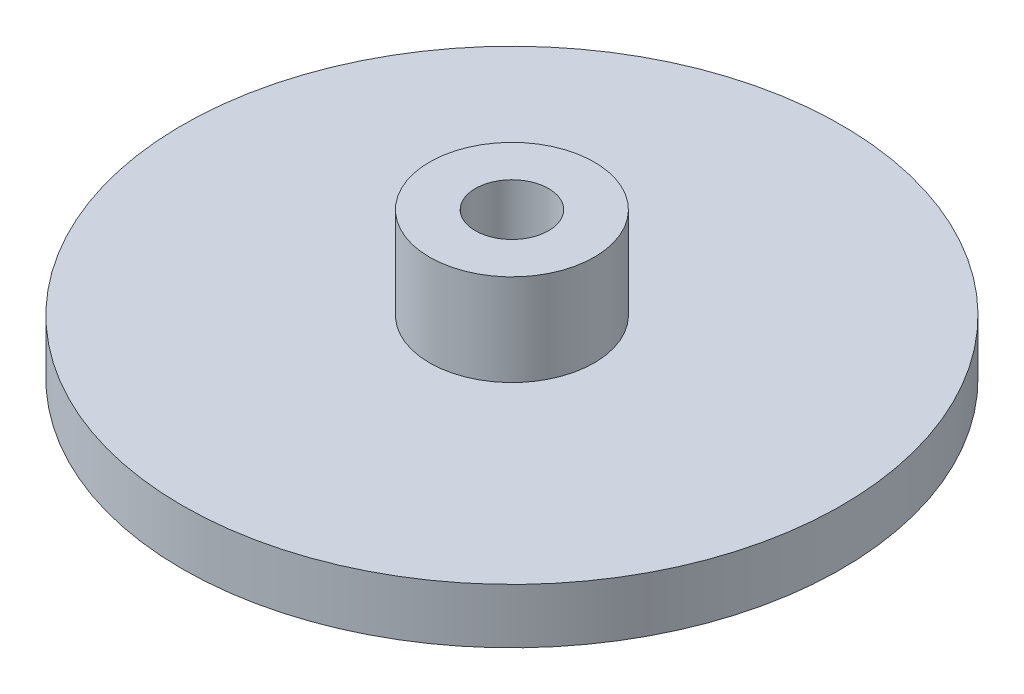
ISO-10303-21;
HEADER;
FILE_DESCRIPTION(('STEP AP214'),'2;1');
FILE_NAME('part.step','',(''),(''),'','','');
FILE_SCHEMA(('AUTOMOTIVE_DESIGN { 1 0 10303 214 1 1 1 1 }'));
ENDSEC;
DATA;
#1=APPLICATION_CONTEXT('core data for automotive mechanical design processes');
#2=APPLICATION_PROTOCOL_DEFINITION('international standard','automotive_design',2000,#1);
#3=PRODUCT_CONTEXT('',#1,'mechanical');
#4=PRODUCT('Part','Part','',(#3));
#5=PRODUCT_RELATED_PRODUCT_CATEGORY('part','',(#4));
#6=PRODUCT_DEFINITION_FORMATION('','',#4);
#7=PRODUCT_DEFINITION_CONTEXT('part definition',#1,'design');
#8=PRODUCT_DEFINITION('design','',#6,#7);
#9=PRODUCT_DEFINITION_SHAPE('','',#8);
#10=(LENGTH_UNIT() NAMED_UNIT(*) SI_UNIT(.MILLI.,.METRE.));
#11=(NAMED_UNIT(*) PLANE_ANGLE_UNIT() SI_UNIT($,.RADIAN.));
#12=(NAMED_UNIT(*) SI_UNIT($,.STERADIAN.) SOLID_ANGLE_UNIT());
#13=UNCERTAINTY_MEASURE_WITH_UNIT(LENGTH_MEASURE(1.E-05),#10,'distance_accuracy_value','');
#14=(GEOMETRIC_REPRESENTATION_CONTEXT(3) GLOBAL_UNCERTAINTY_ASSIGNED_CONTEXT((#13)) GLOBAL_UNIT_ASSIGNED_CONTEXT((#10,
#11,#12)) REPRESENTATION_CONTEXT('',''));
#15=CARTESIAN_POINT('',(0.,0.,0.));
#16=DIRECTION('',(0.,0.,1.));
#17=DIRECTION('',(1.,0.,0.));
#18=AXIS2_PLACEMENT_3D('',#15,#16,#17);
#19=CARTESIAN_POINT('',(0.,6.,0.));
#20=DIRECTION('',(0.,1.,0.));
#21=DIRECTION('',(0.,0.,1.));
#22=AXIS2_PLACEMENT_3D('',#19,#20,#21);
#23=PLANE('',#22);
#24=CARTESIAN_POINT('',(0.,6.,0.));
#25=DIRECTION('',(0.,1.,0.));
#26=DIRECTION('',(0.,0.,1.));
#27=AXIS2_PLACEMENT_3D('',#24,#25,#26);
#28=CIRCLE('',#27,36.);
#29=CARTESIAN_POINT('',(0.,6.,36.));
#30=VERTEX_POINT('',#29);
#31=EDGE_CURVE('E10',#30,#30,#28,.T.);
#32=ORIENTED_EDGE('',*,*,#31,.T.);
#33=EDGE_LOOP('',(#32));
#34=FACE_BOUND('',#33,.T.);
#35=CARTESIAN_POINT('',(0.,6.,0.));
#36=DIRECTION('',(0.,1.,0.));
#37=DIRECTION('',(0.,0.,1.));
#38=AXIS2_PLACEMENT_3D('',#35,#36,#37);
#39=CIRCLE('',#38,9.);
#40=CARTESIAN_POINT('',(0.,6.,9.));
#41=VERTEX_POINT('',#40);
#42=EDGE_CURVE('E43',#41,#41,#39,.T.);
#43=ORIENTED_EDGE('',*,*,#42,.F.);
#44=EDGE_LOOP('',(#43));
#45=FACE_BOUND('',#44,.T.);
#46=ADVANCED_FACE('F30',(#34,#45),#23,.T.);
#47=CARTESIAN_POINT('',(0.,6.,0.));
#48=DIRECTION('',(0.,-1.,0.));
#49=DIRECTION('',(0.,0.,-1.));
#50=AXIS2_PLACEMENT_3D('',#47,#48,#49);
#51=CYLINDRICAL_SURFACE('',#50,36.);
#52=ORIENTED_EDGE('',*,*,#31,.F.);
#53=EDGE_LOOP('',(#52));
#54=FACE_BOUND('',#53,.T.);
#55=CARTESIAN_POINT('',(0.,0.,0.));
#56=DIRECTION('',(0.,1.,0.));
#57=DIRECTION('',(0.,0.,1.));
#58=AXIS2_PLACEMENT_3D('',#55,#56,#57);
#59=CIRCLE('',#58,36.);
#60=CARTESIAN_POINT('',(0.,0.,36.));
#61=VERTEX_POINT('',#60);
#62=EDGE_CURVE('E34',#61,#61,#59,.T.);
#63=ORIENTED_EDGE('',*,*,#62,.T.);
#64=EDGE_LOOP('',(#63));
#65=FACE_BOUND('',#64,.T.);
#66=ADVANCED_FACE('F32',(#54,#65),#51,.T.);
#67=CARTESIAN_POINT('',(0.,0.,0.));
#68=DIRECTION('',(0.,1.,0.));
#69=DIRECTION('',(0.,0.,1.));
#70=AXIS2_PLACEMENT_3D('',#67,#68,#69);
#71=PLANE('',#70);
#72=CARTESIAN_POINT('',(0.,0.,0.));
#73=DIRECTION('',(0.,1.,0.));
#74=DIRECTION('',(0.,0.,1.));
#75=AXIS2_PLACEMENT_3D('',#72,#73,#74);
#76=CIRCLE('',#75,4.);
#77=CARTESIAN_POINT('',(0.,0.,4.));
#78=VERTEX_POINT('',#77);
#79=EDGE_CURVE('E46',#78,#78,#76,.T.);
#80=ORIENTED_EDGE('',*,*,#79,.T.);
#81=EDGE_LOOP('',(#80));
#82=FACE_BOUND('',#81,.T.);
#83=ORIENTED_EDGE('',*,*,#62,.F.);
#84=EDGE_LOOP('',(#83));
#85=FACE_BOUND('',#84,.T.);
#86=ADVANCED_FACE('F55',(#82,#85),#71,.F.);
#87=CARTESIAN_POINT('',(0.,16.,0.));
#88=DIRECTION('',(0.,-1.,0.));
#89=DIRECTION('',(0.,0.,-1.));
#90=AXIS2_PLACEMENT_3D('',#87,#88,#89);
#91=CYLINDRICAL_SURFACE('',#90,9.);
#92=CARTESIAN_POINT('',(0.,16.,0.));
#93=DIRECTION('',(0.,1.,0.));
#94=DIRECTION('',(0.,0.,1.));
#95=AXIS2_PLACEMENT_3D('',#92,#93,#94);
#96=CIRCLE('',#95,9.);
#97=CARTESIAN_POINT('',(0.,16.,9.));
#98=VERTEX_POINT('',#97);
#99=EDGE_CURVE('E41',#98,#98,#96,.T.);
#100=ORIENTED_EDGE('',*,*,#99,.F.);
#101=EDGE_LOOP('',(#100));
#102=FACE_BOUND('',#101,.T.);
#103=ORIENTED_EDGE('',*,*,#42,.T.);
#104=EDGE_LOOP('',(#103));
#105=FACE_BOUND('',#104,.T.);
#106=ADVANCED_FACE('F67',(#102,#105),#91,.T.);
#107=CARTESIAN_POINT('',(0.,16.,0.));
#108=DIRECTION('',(0.,1.,0.));
#109=DIRECTION('',(0.,0.,1.));
#110=AXIS2_PLACEMENT_3D('',#107,#108,#109);
#111=PLANE('',#110);
#112=CARTESIAN_POINT('',(0.,16.,0.));
#113=DIRECTION('',(0.,1.,0.));
#114=DIRECTION('',(0.,0.,1.));
#115=AXIS2_PLACEMENT_3D('',#112,#113,#114);
#116=CIRCLE('',#115,4.);
#117=CARTESIAN_POINT('',(0.,16.,4.));
#118=VERTEX_POINT('',#117);
#119=EDGE_CURVE('E49',#118,#118,#116,.T.);
#120=ORIENTED_EDGE('',*,*,#119,.F.);
#121=EDGE_LOOP('',(#120));
#122=FACE_BOUND('',#121,.T.);
#123=ORIENTED_EDGE('',*,*,#99,.T.);
#124=EDGE_LOOP('',(#123));
#125=FACE_BOUND('',#124,.T.);
#126=ADVANCED_FACE('F61',(#122,#125),#111,.T.);
#127=CARTESIAN_POINT('',(0.,0.,0.));
#128=DIRECTION('',(0.,1.,0.));
#129=DIRECTION('',(0.,0.,1.));
#130=AXIS2_PLACEMENT_3D('',#127,#128,#129);
#131=CYLINDRICAL_SURFACE('',#130,4.);
#132=ORIENTED_EDGE('',*,*,#79,.F.);
#133=EDGE_LOOP('',(#132));
#134=FACE_BOUND('',#133,.T.);
#135=ORIENTED_EDGE('',*,*,#119,.T.);
#136=EDGE_LOOP('',(#135));
#137=FACE_BOUND('',#136,.T.);
#138=ADVANCED_FACE('F58',(#134,#137),#131,.F.);
#139=CLOSED_SHELL('',(#46,#66,#86,#106,#126,#138));
#140=MANIFOLD_SOLID_BREP('B2',#139);
#141=ADVANCED_BREP_SHAPE_REPRESENTATION('',(#18,#140),#14);
#142=SHAPE_DEFINITION_REPRESENTATION(#9,#141);
ENDSEC;
END-ISO-10303-21;
